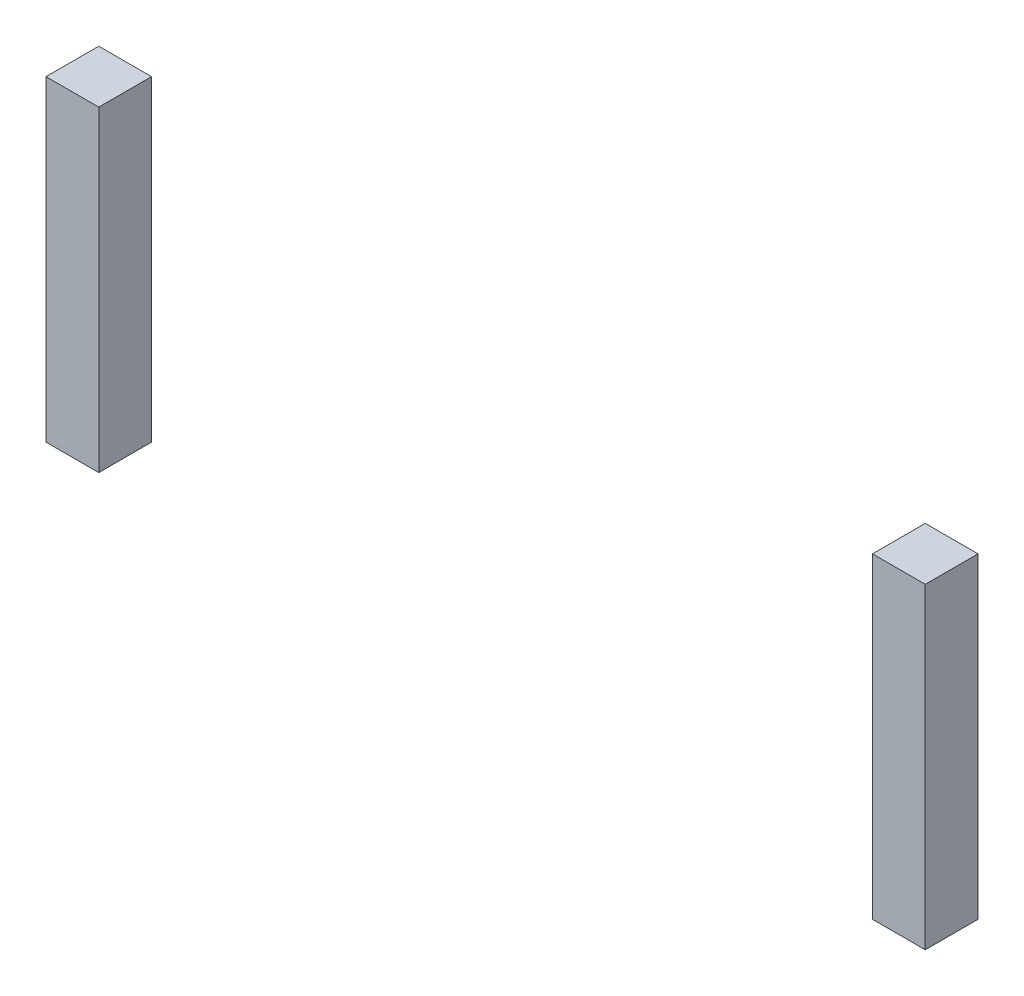
ISO-10303-21;
HEADER;
FILE_DESCRIPTION(('STEP AP214'),'2;1');
FILE_NAME('part.step','',(''),(''),'','','');
FILE_SCHEMA(('AUTOMOTIVE_DESIGN { 1 0 10303 214 1 1 1 1 }'));
ENDSEC;
DATA;
#1=APPLICATION_CONTEXT('core data for automotive mechanical design processes');
#2=APPLICATION_PROTOCOL_DEFINITION('international standard','automotive_design',2000,#1);
#3=PRODUCT_CONTEXT('',#1,'mechanical');
#4=PRODUCT('Part','Part','',(#3));
#5=PRODUCT_RELATED_PRODUCT_CATEGORY('part','',(#4));
#6=PRODUCT_DEFINITION_FORMATION('','',#4);
#7=PRODUCT_DEFINITION_CONTEXT('part definition',#1,'design');
#8=PRODUCT_DEFINITION('design','',#6,#7);
#9=PRODUCT_DEFINITION_SHAPE('','',#8);
#10=(LENGTH_UNIT() NAMED_UNIT(*) SI_UNIT(.MILLI.,.METRE.));
#11=(NAMED_UNIT(*) PLANE_ANGLE_UNIT() SI_UNIT($,.RADIAN.));
#12=(NAMED_UNIT(*) SI_UNIT($,.STERADIAN.) SOLID_ANGLE_UNIT());
#13=UNCERTAINTY_MEASURE_WITH_UNIT(LENGTH_MEASURE(1.E-05),#10,'distance_accuracy_value','');
#14=(GEOMETRIC_REPRESENTATION_CONTEXT(3) GLOBAL_UNCERTAINTY_ASSIGNED_CONTEXT((#13)) GLOBAL_UNIT_ASSIGNED_CONTEXT((#10,
#11,#12)) REPRESENTATION_CONTEXT('',''));
#15=CARTESIAN_POINT('',(0.,0.,0.));
#16=DIRECTION('',(0.,0.,1.));
#17=DIRECTION('',(1.,0.,0.));
#18=AXIS2_PLACEMENT_3D('',#15,#16,#17);
#19=CARTESIAN_POINT('',(-55.7604937297631,150.047133691249,30.));
#20=DIRECTION('',(1.,0.,0.));
#21=DIRECTION('',(0.,1.,0.));
#22=AXIS2_PLACEMENT_3D('',#19,#20,#21);
#23=PLANE('',#22);
#24=DIRECTION('',(0.,-1.,0.));
#25=VECTOR('',#24,1.);
#26=CARTESIAN_POINT('',(-55.7604937297631,150.047133691249,0.));
#27=LINE('',#26,#25);
#28=CARTESIAN_POINT('',(-55.7604937297631,150.047133691249,0.));
#29=VERTEX_POINT('',#28);
#30=CARTESIAN_POINT('',(-55.7604937297631,-29.9528663087507,0.));
#31=VERTEX_POINT('',#30);
#32=EDGE_CURVE('E12',#29,#31,#27,.T.);
#33=ORIENTED_EDGE('',*,*,#32,.T.);
#34=DIRECTION('',(0.,0.,-1.));
#35=VECTOR('',#34,1.);
#36=CARTESIAN_POINT('',(-55.7604937297631,-29.9528663087507,30.));
#37=LINE('',#36,#35);
#38=CARTESIAN_POINT('',(-55.7604937297631,-29.9528663087507,30.));
#39=VERTEX_POINT('',#38);
#40=EDGE_CURVE('E123',#39,#31,#37,.T.);
#41=ORIENTED_EDGE('',*,*,#40,.F.);
#42=DIRECTION('',(0.,-1.,0.));
#43=VECTOR('',#42,1.);
#44=CARTESIAN_POINT('',(-55.7604937297631,150.047133691249,30.));
#45=LINE('',#44,#43);
#46=CARTESIAN_POINT('',(-55.7604937297631,150.047133691249,30.));
#47=VERTEX_POINT('',#46);
#48=EDGE_CURVE('E56',#47,#39,#45,.T.);
#49=ORIENTED_EDGE('',*,*,#48,.F.);
#50=DIRECTION('',(0.,0.,-1.));
#51=VECTOR('',#50,1.);
#52=CARTESIAN_POINT('',(-55.7604937297631,150.047133691249,30.));
#53=LINE('',#52,#51);
#54=EDGE_CURVE('E96',#47,#29,#53,.T.);
#55=ORIENTED_EDGE('',*,*,#54,.T.);
#56=EDGE_LOOP('',(#33,#41,#49,#55));
#57=FACE_BOUND('',#56,.T.);
#58=ADVANCED_FACE('F52',(#57),#23,.F.);
#59=CARTESIAN_POINT('',(-55.7604937297631,-29.9528663087507,30.));
#60=DIRECTION('',(0.,1.,0.));
#61=DIRECTION('',(0.,0.,1.));
#62=AXIS2_PLACEMENT_3D('',#59,#60,#61);
#63=PLANE('',#62);
#64=DIRECTION('',(1.,0.,0.));
#65=VECTOR('',#64,1.);
#66=CARTESIAN_POINT('',(-55.7604937297631,-29.9528663087507,0.));
#67=LINE('',#66,#65);
#68=CARTESIAN_POINT('',(-25.7604937297631,-29.9528663087507,0.));
#69=VERTEX_POINT('',#68);
#70=EDGE_CURVE('E62',#31,#69,#67,.T.);
#71=ORIENTED_EDGE('',*,*,#70,.T.);
#72=DIRECTION('',(0.,0.,-1.));
#73=VECTOR('',#72,1.);
#74=CARTESIAN_POINT('',(-25.7604937297631,-29.9528663087507,30.));
#75=LINE('',#74,#73);
#76=CARTESIAN_POINT('',(-25.7604937297631,-29.9528663087507,30.));
#77=VERTEX_POINT('',#76);
#78=EDGE_CURVE('E110',#77,#69,#75,.T.);
#79=ORIENTED_EDGE('',*,*,#78,.F.);
#80=DIRECTION('',(1.,0.,0.));
#81=VECTOR('',#80,1.);
#82=CARTESIAN_POINT('',(-55.7604937297631,-29.9528663087507,30.));
#83=LINE('',#82,#81);
#84=EDGE_CURVE('E88',#39,#77,#83,.T.);
#85=ORIENTED_EDGE('',*,*,#84,.F.);
#86=ORIENTED_EDGE('',*,*,#40,.T.);
#87=EDGE_LOOP('',(#71,#79,#85,#86));
#88=FACE_BOUND('',#87,.T.);
#89=ADVANCED_FACE('F126',(#88),#63,.F.);
#90=CARTESIAN_POINT('',(-25.7604937297631,150.047133691249,30.));
#91=DIRECTION('',(1.,0.,0.));
#92=DIRECTION('',(0.,1.,0.));
#93=AXIS2_PLACEMENT_3D('',#90,#91,#92);
#94=PLANE('',#93);
#95=DIRECTION('',(0.,-1.,0.));
#96=VECTOR('',#95,1.);
#97=CARTESIAN_POINT('',(-25.7604937297631,150.047133691249,0.));
#98=LINE('',#97,#96);
#99=CARTESIAN_POINT('',(-25.7604937297631,150.047133691249,0.));
#100=VERTEX_POINT('',#99);
#101=EDGE_CURVE('E112',#100,#69,#98,.T.);
#102=ORIENTED_EDGE('',*,*,#101,.F.);
#103=DIRECTION('',(0.,0.,-1.));
#104=VECTOR('',#103,1.);
#105=CARTESIAN_POINT('',(-25.7604937297631,150.047133691249,30.));
#106=LINE('',#105,#104);
#107=CARTESIAN_POINT('',(-25.7604937297631,150.047133691249,30.));
#108=VERTEX_POINT('',#107);
#109=EDGE_CURVE('E101',#108,#100,#106,.T.);
#110=ORIENTED_EDGE('',*,*,#109,.F.);
#111=DIRECTION('',(0.,-1.,0.));
#112=VECTOR('',#111,1.);
#113=CARTESIAN_POINT('',(-25.7604937297631,150.047133691249,30.));
#114=LINE('',#113,#112);
#115=EDGE_CURVE('E121',#108,#77,#114,.T.);
#116=ORIENTED_EDGE('',*,*,#115,.T.);
#117=ORIENTED_EDGE('',*,*,#78,.T.);
#118=EDGE_LOOP('',(#102,#110,#116,#117));
#119=FACE_BOUND('',#118,.T.);
#120=ADVANCED_FACE('F113',(#119),#94,.T.);
#121=CARTESIAN_POINT('',(-55.7604937297631,150.047133691249,30.));
#122=DIRECTION('',(0.,1.,0.));
#123=DIRECTION('',(0.,0.,1.));
#124=AXIS2_PLACEMENT_3D('',#121,#122,#123);
#125=PLANE('',#124);
#126=DIRECTION('',(1.,0.,0.));
#127=VECTOR('',#126,1.);
#128=CARTESIAN_POINT('',(-55.7604937297631,150.047133691249,0.));
#129=LINE('',#128,#127);
#130=EDGE_CURVE('E105',#29,#100,#129,.T.);
#131=ORIENTED_EDGE('',*,*,#130,.F.);
#132=ORIENTED_EDGE('',*,*,#54,.F.);
#133=DIRECTION('',(1.,0.,0.));
#134=VECTOR('',#133,1.);
#135=CARTESIAN_POINT('',(-55.7604937297631,150.047133691249,30.));
#136=LINE('',#135,#134);
#137=EDGE_CURVE('E107',#47,#108,#136,.T.);
#138=ORIENTED_EDGE('',*,*,#137,.T.);
#139=ORIENTED_EDGE('',*,*,#109,.T.);
#140=EDGE_LOOP('',(#131,#132,#138,#139));
#141=FACE_BOUND('',#140,.T.);
#142=ADVANCED_FACE('F103',(#141),#125,.T.);
#143=CARTESIAN_POINT('',(0.,0.,30.));
#144=DIRECTION('',(0.,0.,1.));
#145=DIRECTION('',(1.,0.,0.));
#146=AXIS2_PLACEMENT_3D('',#143,#144,#145);
#147=PLANE('',#146);
#148=ORIENTED_EDGE('',*,*,#48,.T.);
#149=ORIENTED_EDGE('',*,*,#84,.T.);
#150=ORIENTED_EDGE('',*,*,#115,.F.);
#151=ORIENTED_EDGE('',*,*,#137,.F.);
#152=EDGE_LOOP('',(#148,#149,#150,#151));
#153=FACE_BOUND('',#152,.T.);
#154=ADVANCED_FACE('F54',(#153),#147,.T.);
#155=CARTESIAN_POINT('',(0.,0.,0.));
#156=DIRECTION('',(0.,0.,1.));
#157=DIRECTION('',(1.,0.,0.));
#158=AXIS2_PLACEMENT_3D('',#155,#156,#157);
#159=PLANE('',#158);
#160=ORIENTED_EDGE('',*,*,#32,.F.);
#161=ORIENTED_EDGE('',*,*,#130,.T.);
#162=ORIENTED_EDGE('',*,*,#101,.T.);
#163=ORIENTED_EDGE('',*,*,#70,.F.);
#164=EDGE_LOOP('',(#160,#161,#162,#163));
#165=FACE_BOUND('',#164,.T.);
#166=ADVANCED_FACE('F115',(#165),#159,.F.);
#167=CLOSED_SHELL('',(#58,#89,#120,#142,#154,#166));
#168=MANIFOLD_SOLID_BREP('B2',#167);
#169=CARTESIAN_POINT('',(414.239506270237,150.047133691249,30.));
#170=DIRECTION('',(1.,0.,0.));
#171=DIRECTION('',(0.,0.,-1.));
#172=AXIS2_PLACEMENT_3D('',#169,#170,#171);
#173=PLANE('',#172);
#174=DIRECTION('',(0.,-1.,0.));
#175=VECTOR('',#174,1.);
#176=CARTESIAN_POINT('',(414.239506270237,150.047133691249,0.));
#177=LINE('',#176,#175);
#178=CARTESIAN_POINT('',(414.239506270237,150.047133691249,0.));
#179=VERTEX_POINT('',#178);
#180=CARTESIAN_POINT('',(414.239506270237,-29.9528663087507,0.));
#181=VERTEX_POINT('',#180);
#182=EDGE_CURVE('E255',#179,#181,#177,.T.);
#183=ORIENTED_EDGE('',*,*,#182,.T.);
#184=DIRECTION('',(0.,0.,-1.));
#185=VECTOR('',#184,1.);
#186=CARTESIAN_POINT('',(414.239506270237,-29.9528663087507,30.));
#187=LINE('',#186,#185);
#188=CARTESIAN_POINT('',(414.239506270237,-29.9528663087507,30.));
#189=VERTEX_POINT('',#188);
#190=EDGE_CURVE('E50',#189,#181,#187,.T.);
#191=ORIENTED_EDGE('',*,*,#190,.F.);
#192=DIRECTION('',(0.,-1.,0.));
#193=VECTOR('',#192,1.);
#194=CARTESIAN_POINT('',(414.239506270237,150.047133691249,30.));
#195=LINE('',#194,#193);
#196=CARTESIAN_POINT('',(414.239506270237,150.047133691249,30.));
#197=VERTEX_POINT('',#196);
#198=EDGE_CURVE('E237',#197,#189,#195,.T.);
#199=ORIENTED_EDGE('',*,*,#198,.F.);
#200=DIRECTION('',(0.,0.,-1.));
#201=VECTOR('',#200,1.);
#202=CARTESIAN_POINT('',(414.239506270237,150.047133691249,30.));
#203=LINE('',#202,#201);
#204=EDGE_CURVE('E204',#197,#179,#203,.T.);
#205=ORIENTED_EDGE('',*,*,#204,.T.);
#206=EDGE_LOOP('',(#183,#191,#199,#205));
#207=FACE_BOUND('',#206,.T.);
#208=ADVANCED_FACE('F187',(#207),#173,.F.);
#209=CARTESIAN_POINT('',(414.239506270237,-29.9528663087507,30.));
#210=DIRECTION('',(0.,1.,0.));
#211=DIRECTION('',(-1.,0.,0.));
#212=AXIS2_PLACEMENT_3D('',#209,#210,#211);
#213=PLANE('',#212);
#214=DIRECTION('',(1.,0.,0.));
#215=VECTOR('',#214,1.);
#216=CARTESIAN_POINT('',(414.239506270237,-29.9528663087507,0.));
#217=LINE('',#216,#215);
#218=CARTESIAN_POINT('',(444.239506270237,-29.9528663087507,0.));
#219=VERTEX_POINT('',#218);
#220=EDGE_CURVE('E243',#181,#219,#217,.T.);
#221=ORIENTED_EDGE('',*,*,#220,.T.);
#222=DIRECTION('',(0.,0.,-1.));
#223=VECTOR('',#222,1.);
#224=CARTESIAN_POINT('',(444.239506270237,-29.9528663087507,30.));
#225=LINE('',#224,#223);
#226=CARTESIAN_POINT('',(444.239506270237,-29.9528663087507,30.));
#227=VERTEX_POINT('',#226);
#228=EDGE_CURVE('E196',#227,#219,#225,.T.);
#229=ORIENTED_EDGE('',*,*,#228,.F.);
#230=DIRECTION('',(1.,0.,0.));
#231=VECTOR('',#230,1.);
#232=CARTESIAN_POINT('',(414.239506270237,-29.9528663087507,30.));
#233=LINE('',#232,#231);
#234=EDGE_CURVE('E229',#189,#227,#233,.T.);
#235=ORIENTED_EDGE('',*,*,#234,.F.);
#236=ORIENTED_EDGE('',*,*,#190,.T.);
#237=EDGE_LOOP('',(#221,#229,#235,#236));
#238=FACE_BOUND('',#237,.T.);
#239=ADVANCED_FACE('F242',(#238),#213,.F.);
#240=CARTESIAN_POINT('',(444.239506270237,150.047133691249,30.));
#241=DIRECTION('',(1.,0.,0.));
#242=DIRECTION('',(0.,0.,-1.));
#243=AXIS2_PLACEMENT_3D('',#240,#241,#242);
#244=PLANE('',#243);
#245=DIRECTION('',(0.,-1.,0.));
#246=VECTOR('',#245,1.);
#247=CARTESIAN_POINT('',(444.239506270237,150.047133691249,0.));
#248=LINE('',#247,#246);
#249=CARTESIAN_POINT('',(444.239506270237,150.047133691249,0.));
#250=VERTEX_POINT('',#249);
#251=EDGE_CURVE('E260',#250,#219,#248,.T.);
#252=ORIENTED_EDGE('',*,*,#251,.F.);
#253=DIRECTION('',(0.,0.,-1.));
#254=VECTOR('',#253,1.);
#255=CARTESIAN_POINT('',(444.239506270237,150.047133691249,30.));
#256=LINE('',#255,#254);
#257=CARTESIAN_POINT('',(444.239506270237,150.047133691249,30.));
#258=VERTEX_POINT('',#257);
#259=EDGE_CURVE('E218',#258,#250,#256,.T.);
#260=ORIENTED_EDGE('',*,*,#259,.F.);
#261=DIRECTION('',(0.,-1.,0.));
#262=VECTOR('',#261,1.);
#263=CARTESIAN_POINT('',(444.239506270237,150.047133691249,30.));
#264=LINE('',#263,#262);
#265=EDGE_CURVE('E236',#258,#227,#264,.T.);
#266=ORIENTED_EDGE('',*,*,#265,.T.);
#267=ORIENTED_EDGE('',*,*,#228,.T.);
#268=EDGE_LOOP('',(#252,#260,#266,#267));
#269=FACE_BOUND('',#268,.T.);
#270=ADVANCED_FACE('F247',(#269),#244,.T.);
#271=CARTESIAN_POINT('',(414.239506270237,150.047133691249,30.));
#272=DIRECTION('',(0.,1.,0.));
#273=DIRECTION('',(0.,0.,1.));
#274=AXIS2_PLACEMENT_3D('',#271,#272,#273);
#275=PLANE('',#274);
#276=DIRECTION('',(1.,0.,0.));
#277=VECTOR('',#276,1.);
#278=CARTESIAN_POINT('',(414.239506270237,150.047133691249,0.));
#279=LINE('',#278,#277);
#280=EDGE_CURVE('E263',#179,#250,#279,.T.);
#281=ORIENTED_EDGE('',*,*,#280,.F.);
#282=ORIENTED_EDGE('',*,*,#204,.F.);
#283=DIRECTION('',(1.,0.,0.));
#284=VECTOR('',#283,1.);
#285=CARTESIAN_POINT('',(414.239506270237,150.047133691249,30.));
#286=LINE('',#285,#284);
#287=EDGE_CURVE('E249',#197,#258,#286,.T.);
#288=ORIENTED_EDGE('',*,*,#287,.T.);
#289=ORIENTED_EDGE('',*,*,#259,.T.);
#290=EDGE_LOOP('',(#281,#282,#288,#289));
#291=FACE_BOUND('',#290,.T.);
#292=ADVANCED_FACE('F273',(#291),#275,.T.);
#293=CARTESIAN_POINT('',(0.,0.,30.));
#294=DIRECTION('',(0.,0.,1.));
#295=DIRECTION('',(1.,0.,0.));
#296=AXIS2_PLACEMENT_3D('',#293,#294,#295);
#297=PLANE('',#296);
#298=ORIENTED_EDGE('',*,*,#198,.T.);
#299=ORIENTED_EDGE('',*,*,#234,.T.);
#300=ORIENTED_EDGE('',*,*,#265,.F.);
#301=ORIENTED_EDGE('',*,*,#287,.F.);
#302=EDGE_LOOP('',(#298,#299,#300,#301));
#303=FACE_BOUND('',#302,.T.);
#304=ADVANCED_FACE('F233',(#303),#297,.T.);
#305=CARTESIAN_POINT('',(0.,0.,0.));
#306=DIRECTION('',(0.,0.,1.));
#307=DIRECTION('',(1.,0.,0.));
#308=AXIS2_PLACEMENT_3D('',#305,#306,#307);
#309=PLANE('',#308);
#310=ORIENTED_EDGE('',*,*,#182,.F.);
#311=ORIENTED_EDGE('',*,*,#280,.T.);
#312=ORIENTED_EDGE('',*,*,#251,.T.);
#313=ORIENTED_EDGE('',*,*,#220,.F.);
#314=EDGE_LOOP('',(#310,#311,#312,#313));
#315=FACE_BOUND('',#314,.T.);
#316=ADVANCED_FACE('F272',(#315),#309,.F.);
#317=CLOSED_SHELL('',(#208,#239,#270,#292,#304,#316));
#318=MANIFOLD_SOLID_BREP('B6',#317);
#319=ADVANCED_BREP_SHAPE_REPRESENTATION('',(#18,#168,#318),#14);
#320=SHAPE_DEFINITION_REPRESENTATION(#9,#319);
ENDSEC;
END-ISO-10303-21;
